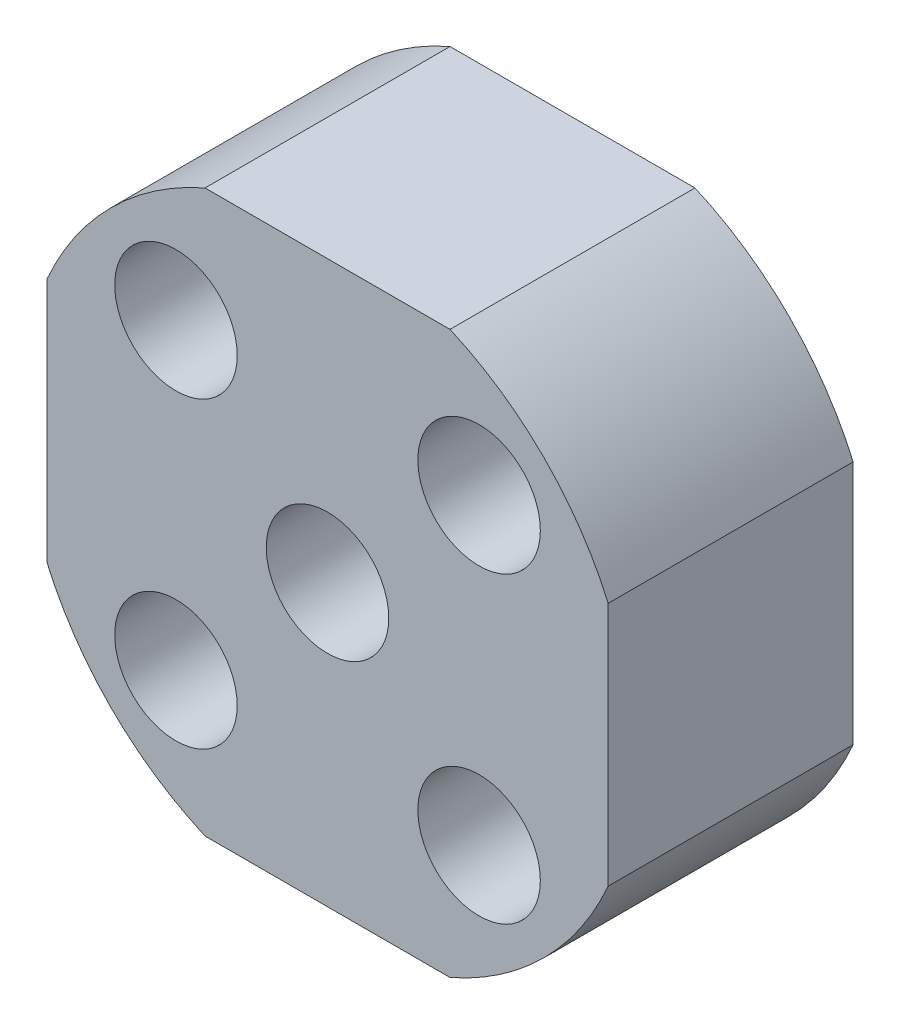
ISO-10303-21;
HEADER;
FILE_DESCRIPTION(('STEP AP214'),'2;1');
FILE_NAME('part.step','',(''),(''),'','','');
FILE_SCHEMA(('AUTOMOTIVE_DESIGN { 1 0 10303 214 1 1 1 1 }'));
ENDSEC;
DATA;
#1=APPLICATION_CONTEXT('core data for automotive mechanical design processes');
#2=APPLICATION_PROTOCOL_DEFINITION('international standard','automotive_design',2000,#1);
#3=PRODUCT_CONTEXT('',#1,'mechanical');
#4=PRODUCT('Part','Part','',(#3));
#5=PRODUCT_RELATED_PRODUCT_CATEGORY('part','',(#4));
#6=PRODUCT_DEFINITION_FORMATION('','',#4);
#7=PRODUCT_DEFINITION_CONTEXT('part definition',#1,'design');
#8=PRODUCT_DEFINITION('design','',#6,#7);
#9=PRODUCT_DEFINITION_SHAPE('','',#8);
#10=(LENGTH_UNIT() NAMED_UNIT(*) SI_UNIT(.MILLI.,.METRE.));
#11=(NAMED_UNIT(*) PLANE_ANGLE_UNIT() SI_UNIT($,.RADIAN.));
#12=(NAMED_UNIT(*) SI_UNIT($,.STERADIAN.) SOLID_ANGLE_UNIT());
#13=UNCERTAINTY_MEASURE_WITH_UNIT(LENGTH_MEASURE(1.E-05),#10,'distance_accuracy_value','');
#14=(GEOMETRIC_REPRESENTATION_CONTEXT(3) GLOBAL_UNCERTAINTY_ASSIGNED_CONTEXT((#13)) GLOBAL_UNIT_ASSIGNED_CONTEXT((#10,
#11,#12)) REPRESENTATION_CONTEXT('',''));
#15=CARTESIAN_POINT('',(0.,0.,0.));
#16=DIRECTION('',(0.,0.,1.));
#17=DIRECTION('',(1.,0.,0.));
#18=AXIS2_PLACEMENT_3D('',#15,#16,#17);
#19=CARTESIAN_POINT('',(0.,0.,2.));
#20=DIRECTION('',(0.,0.,1.));
#21=DIRECTION('',(1.,0.,0.));
#22=AXIS2_PLACEMENT_3D('',#19,#20,#21);
#23=PLANE('',#22);
#24=CARTESIAN_POINT('',(-1.23743686707646,-1.23743686707646,2.));
#25=DIRECTION('',(0.,0.,1.));
#26=DIRECTION('',(1.,0.,0.));
#27=AXIS2_PLACEMENT_3D('',#24,#25,#26);
#28=CIRCLE('',#27,0.5);
#29=CARTESIAN_POINT('',(-0.737436867076457,-1.23743686707646,2.));
#30=VERTEX_POINT('',#29);
#31=EDGE_CURVE('E195',#30,#30,#28,.T.);
#32=ORIENTED_EDGE('',*,*,#31,.F.);
#33=EDGE_LOOP('',(#32));
#34=FACE_BOUND('',#33,.T.);
#35=CARTESIAN_POINT('',(1.23743686707646,1.23743686707646,2.));
#36=DIRECTION('',(0.,0.,1.));
#37=DIRECTION('',(1.,0.,0.));
#38=AXIS2_PLACEMENT_3D('',#35,#36,#37);
#39=CIRCLE('',#38,0.5);
#40=CARTESIAN_POINT('',(1.73743686707646,1.23743686707646,2.));
#41=VERTEX_POINT('',#40);
#42=EDGE_CURVE('E183',#41,#41,#39,.T.);
#43=ORIENTED_EDGE('',*,*,#42,.F.);
#44=EDGE_LOOP('',(#43));
#45=FACE_BOUND('',#44,.T.);
#46=CARTESIAN_POINT('',(0.,0.,2.));
#47=DIRECTION('',(0.,0.,1.));
#48=DIRECTION('',(1.,0.,0.));
#49=AXIS2_PLACEMENT_3D('',#46,#47,#48);
#50=CIRCLE('',#49,2.5);
#51=CARTESIAN_POINT('',(2.29128784747792,1.,2.));
#52=VERTEX_POINT('',#51);
#53=CARTESIAN_POINT('',(1.,2.29128784747792,2.));
#54=VERTEX_POINT('',#53);
#55=EDGE_CURVE('E146',#52,#54,#50,.T.);
#56=ORIENTED_EDGE('',*,*,#55,.T.);
#57=DIRECTION('',(-1.,0.,0.));
#58=VECTOR('',#57,1.);
#59=CARTESIAN_POINT('',(1.,2.29128784747792,2.));
#60=LINE('',#59,#58);
#61=CARTESIAN_POINT('',(-1.,2.29128784747792,2.));
#62=VERTEX_POINT('',#61);
#63=EDGE_CURVE('E94',#54,#62,#60,.T.);
#64=ORIENTED_EDGE('',*,*,#63,.T.);
#65=CARTESIAN_POINT('',(0.,0.,2.));
#66=DIRECTION('',(0.,0.,1.));
#67=DIRECTION('',(1.,0.,0.));
#68=AXIS2_PLACEMENT_3D('',#65,#66,#67);
#69=CIRCLE('',#68,2.5);
#70=CARTESIAN_POINT('',(-2.29128784747792,1.,2.));
#71=VERTEX_POINT('',#70);
#72=EDGE_CURVE('E161',#62,#71,#69,.T.);
#73=ORIENTED_EDGE('',*,*,#72,.T.);
#74=DIRECTION('',(0.,-1.,0.));
#75=VECTOR('',#74,1.);
#76=CARTESIAN_POINT('',(-2.29128784747792,1.,2.));
#77=LINE('',#76,#75);
#78=CARTESIAN_POINT('',(-2.29128784747792,-1.,2.));
#79=VERTEX_POINT('',#78);
#80=EDGE_CURVE('E174',#71,#79,#77,.T.);
#81=ORIENTED_EDGE('',*,*,#80,.T.);
#82=CARTESIAN_POINT('',(0.,0.,2.));
#83=DIRECTION('',(0.,0.,1.));
#84=DIRECTION('',(1.,0.,0.));
#85=AXIS2_PLACEMENT_3D('',#82,#83,#84);
#86=CIRCLE('',#85,2.5);
#87=CARTESIAN_POINT('',(-1.,-2.29128784747792,2.));
#88=VERTEX_POINT('',#87);
#89=EDGE_CURVE('E113',#79,#88,#86,.T.);
#90=ORIENTED_EDGE('',*,*,#89,.T.);
#91=DIRECTION('',(1.,0.,0.));
#92=VECTOR('',#91,1.);
#93=CARTESIAN_POINT('',(-1.,-2.29128784747792,2.));
#94=LINE('',#93,#92);
#95=CARTESIAN_POINT('',(1.,-2.29128784747792,2.));
#96=VERTEX_POINT('',#95);
#97=EDGE_CURVE('E107',#88,#96,#94,.T.);
#98=ORIENTED_EDGE('',*,*,#97,.T.);
#99=CARTESIAN_POINT('',(0.,0.,2.));
#100=DIRECTION('',(0.,0.,1.));
#101=DIRECTION('',(1.,0.,0.));
#102=AXIS2_PLACEMENT_3D('',#99,#100,#101);
#103=CIRCLE('',#102,2.5);
#104=CARTESIAN_POINT('',(2.29128784747792,-1.,2.));
#105=VERTEX_POINT('',#104);
#106=EDGE_CURVE('E111',#96,#105,#103,.T.);
#107=ORIENTED_EDGE('',*,*,#106,.T.);
#108=DIRECTION('',(0.,1.,0.));
#109=VECTOR('',#108,1.);
#110=CARTESIAN_POINT('',(2.29128784747792,1.,2.));
#111=LINE('',#110,#109);
#112=EDGE_CURVE('E51',#105,#52,#111,.T.);
#113=ORIENTED_EDGE('',*,*,#112,.T.);
#114=EDGE_LOOP('',(#56,#64,#73,#81,#90,#98,#107,#113));
#115=FACE_BOUND('',#114,.T.);
#116=CARTESIAN_POINT('',(0.,0.,2.));
#117=DIRECTION('',(0.,0.,1.));
#118=DIRECTION('',(1.,0.,0.));
#119=AXIS2_PLACEMENT_3D('',#116,#117,#118);
#120=CIRCLE('',#119,0.5);
#121=CARTESIAN_POINT('',(0.5,0.,2.));
#122=VERTEX_POINT('',#121);
#123=EDGE_CURVE('E135',#122,#122,#120,.T.);
#124=ORIENTED_EDGE('',*,*,#123,.F.);
#125=EDGE_LOOP('',(#124));
#126=FACE_BOUND('',#125,.T.);
#127=CARTESIAN_POINT('',(1.23743686707646,-1.23743686707646,2.));
#128=DIRECTION('',(0.,0.,1.));
#129=DIRECTION('',(1.,0.,0.));
#130=AXIS2_PLACEMENT_3D('',#127,#128,#129);
#131=CIRCLE('',#130,0.5);
#132=CARTESIAN_POINT('',(1.73743686707646,-1.23743686707646,2.));
#133=VERTEX_POINT('',#132);
#134=EDGE_CURVE('E189',#133,#133,#131,.T.);
#135=ORIENTED_EDGE('',*,*,#134,.F.);
#136=EDGE_LOOP('',(#135));
#137=FACE_BOUND('',#136,.T.);
#138=CARTESIAN_POINT('',(-1.23743686707646,1.23743686707646,2.));
#139=DIRECTION('',(0.,0.,1.));
#140=DIRECTION('',(1.,0.,0.));
#141=AXIS2_PLACEMENT_3D('',#138,#139,#140);
#142=CIRCLE('',#141,0.5);
#143=CARTESIAN_POINT('',(-0.737436867076459,1.23743686707646,2.));
#144=VERTEX_POINT('',#143);
#145=EDGE_CURVE('E201',#144,#144,#142,.T.);
#146=ORIENTED_EDGE('',*,*,#145,.F.);
#147=EDGE_LOOP('',(#146));
#148=FACE_BOUND('',#147,.T.);
#149=ADVANCED_FACE('F34',(#34,#45,#115,#126,#137,#148),#23,.T.);
#150=CARTESIAN_POINT('',(0.,0.,0.));
#151=DIRECTION('',(0.,0.,1.));
#152=DIRECTION('',(1.,0.,0.));
#153=AXIS2_PLACEMENT_3D('',#150,#151,#152);
#154=PLANE('',#153);
#155=CARTESIAN_POINT('',(0.,0.,0.));
#156=DIRECTION('',(0.,0.,1.));
#157=DIRECTION('',(1.,0.,0.));
#158=AXIS2_PLACEMENT_3D('',#155,#156,#157);
#159=CIRCLE('',#158,2.5);
#160=CARTESIAN_POINT('',(2.29128784747792,1.,0.));
#161=VERTEX_POINT('',#160);
#162=CARTESIAN_POINT('',(1.,2.29128784747792,0.));
#163=VERTEX_POINT('',#162);
#164=EDGE_CURVE('E131',#161,#163,#159,.T.);
#165=ORIENTED_EDGE('',*,*,#164,.F.);
#166=DIRECTION('',(0.,1.,0.));
#167=VECTOR('',#166,1.);
#168=CARTESIAN_POINT('',(2.29128784747792,1.,0.));
#169=LINE('',#168,#167);
#170=CARTESIAN_POINT('',(2.29128784747792,-1.,0.));
#171=VERTEX_POINT('',#170);
#172=EDGE_CURVE('E86',#171,#161,#169,.T.);
#173=ORIENTED_EDGE('',*,*,#172,.F.);
#174=CARTESIAN_POINT('',(0.,0.,0.));
#175=DIRECTION('',(0.,0.,1.));
#176=DIRECTION('',(1.,0.,0.));
#177=AXIS2_PLACEMENT_3D('',#174,#175,#176);
#178=CIRCLE('',#177,2.5);
#179=CARTESIAN_POINT('',(1.,-2.29128784747792,0.));
#180=VERTEX_POINT('',#179);
#181=EDGE_CURVE('E80',#180,#171,#178,.T.);
#182=ORIENTED_EDGE('',*,*,#181,.F.);
#183=DIRECTION('',(1.,0.,0.));
#184=VECTOR('',#183,1.);
#185=CARTESIAN_POINT('',(-1.,-2.29128784747792,0.));
#186=LINE('',#185,#184);
#187=CARTESIAN_POINT('',(-1.,-2.29128784747792,0.));
#188=VERTEX_POINT('',#187);
#189=EDGE_CURVE('E121',#188,#180,#186,.T.);
#190=ORIENTED_EDGE('',*,*,#189,.F.);
#191=CARTESIAN_POINT('',(0.,0.,0.));
#192=DIRECTION('',(0.,0.,1.));
#193=DIRECTION('',(1.,0.,0.));
#194=AXIS2_PLACEMENT_3D('',#191,#192,#193);
#195=CIRCLE('',#194,2.5);
#196=CARTESIAN_POINT('',(-2.29128784747792,-1.,0.));
#197=VERTEX_POINT('',#196);
#198=EDGE_CURVE('E141',#197,#188,#195,.T.);
#199=ORIENTED_EDGE('',*,*,#198,.F.);
#200=DIRECTION('',(0.,-1.,0.));
#201=VECTOR('',#200,1.);
#202=CARTESIAN_POINT('',(-2.29128784747792,1.,0.));
#203=LINE('',#202,#201);
#204=CARTESIAN_POINT('',(-2.29128784747792,1.,0.));
#205=VERTEX_POINT('',#204);
#206=EDGE_CURVE('E139',#205,#197,#203,.T.);
#207=ORIENTED_EDGE('',*,*,#206,.F.);
#208=CARTESIAN_POINT('',(0.,0.,0.));
#209=DIRECTION('',(0.,0.,1.));
#210=DIRECTION('',(1.,0.,0.));
#211=AXIS2_PLACEMENT_3D('',#208,#209,#210);
#212=CIRCLE('',#211,2.5);
#213=CARTESIAN_POINT('',(-1.,2.29128784747792,0.));
#214=VERTEX_POINT('',#213);
#215=EDGE_CURVE('E137',#214,#205,#212,.T.);
#216=ORIENTED_EDGE('',*,*,#215,.F.);
#217=DIRECTION('',(-1.,0.,0.));
#218=VECTOR('',#217,1.);
#219=CARTESIAN_POINT('',(1.,2.29128784747792,0.));
#220=LINE('',#219,#218);
#221=EDGE_CURVE('E134',#163,#214,#220,.T.);
#222=ORIENTED_EDGE('',*,*,#221,.F.);
#223=EDGE_LOOP('',(#165,#173,#182,#190,#199,#207,#216,#222));
#224=FACE_BOUND('',#223,.T.);
#225=CARTESIAN_POINT('',(0.,0.,0.));
#226=DIRECTION('',(0.,0.,1.));
#227=DIRECTION('',(1.,0.,0.));
#228=AXIS2_PLACEMENT_3D('',#225,#226,#227);
#229=CIRCLE('',#228,0.5);
#230=CARTESIAN_POINT('',(0.5,0.,0.));
#231=VERTEX_POINT('',#230);
#232=EDGE_CURVE('E180',#231,#231,#229,.T.);
#233=ORIENTED_EDGE('',*,*,#232,.T.);
#234=EDGE_LOOP('',(#233));
#235=FACE_BOUND('',#234,.T.);
#236=CARTESIAN_POINT('',(1.23743686707646,1.23743686707646,0.));
#237=DIRECTION('',(0.,0.,1.));
#238=DIRECTION('',(1.,0.,0.));
#239=AXIS2_PLACEMENT_3D('',#236,#237,#238);
#240=CIRCLE('',#239,0.5);
#241=CARTESIAN_POINT('',(1.73743686707646,1.23743686707646,0.));
#242=VERTEX_POINT('',#241);
#243=EDGE_CURVE('E186',#242,#242,#240,.T.);
#244=ORIENTED_EDGE('',*,*,#243,.T.);
#245=EDGE_LOOP('',(#244));
#246=FACE_BOUND('',#245,.T.);
#247=CARTESIAN_POINT('',(1.23743686707646,-1.23743686707646,0.));
#248=DIRECTION('',(0.,0.,1.));
#249=DIRECTION('',(1.,0.,0.));
#250=AXIS2_PLACEMENT_3D('',#247,#248,#249);
#251=CIRCLE('',#250,0.5);
#252=CARTESIAN_POINT('',(1.73743686707646,-1.23743686707646,0.));
#253=VERTEX_POINT('',#252);
#254=EDGE_CURVE('E192',#253,#253,#251,.T.);
#255=ORIENTED_EDGE('',*,*,#254,.T.);
#256=EDGE_LOOP('',(#255));
#257=FACE_BOUND('',#256,.T.);
#258=CARTESIAN_POINT('',(-1.23743686707646,-1.23743686707646,0.));
#259=DIRECTION('',(0.,0.,1.));
#260=DIRECTION('',(1.,0.,0.));
#261=AXIS2_PLACEMENT_3D('',#258,#259,#260);
#262=CIRCLE('',#261,0.5);
#263=CARTESIAN_POINT('',(-0.737436867076457,-1.23743686707646,0.));
#264=VERTEX_POINT('',#263);
#265=EDGE_CURVE('E198',#264,#264,#262,.T.);
#266=ORIENTED_EDGE('',*,*,#265,.T.);
#267=EDGE_LOOP('',(#266));
#268=FACE_BOUND('',#267,.T.);
#269=CARTESIAN_POINT('',(-1.23743686707646,1.23743686707646,0.));
#270=DIRECTION('',(0.,0.,1.));
#271=DIRECTION('',(1.,0.,0.));
#272=AXIS2_PLACEMENT_3D('',#269,#270,#271);
#273=CIRCLE('',#272,0.5);
#274=CARTESIAN_POINT('',(-0.737436867076459,1.23743686707646,0.));
#275=VERTEX_POINT('',#274);
#276=EDGE_CURVE('E204',#275,#275,#273,.T.);
#277=ORIENTED_EDGE('',*,*,#276,.T.);
#278=EDGE_LOOP('',(#277));
#279=FACE_BOUND('',#278,.T.);
#280=ADVANCED_FACE('F165',(#224,#235,#246,#257,#268,#279),#154,.F.);
#281=CARTESIAN_POINT('',(0.,0.,2.));
#282=DIRECTION('',(0.,0.,-1.));
#283=DIRECTION('',(-1.,0.,0.));
#284=AXIS2_PLACEMENT_3D('',#281,#282,#283);
#285=CYLINDRICAL_SURFACE('',#284,2.5);
#286=ORIENTED_EDGE('',*,*,#164,.T.);
#287=DIRECTION('',(0.,0.,-1.));
#288=VECTOR('',#287,1.);
#289=CARTESIAN_POINT('',(1.,2.29128784747792,2.));
#290=LINE('',#289,#288);
#291=EDGE_CURVE('E11',#54,#163,#290,.T.);
#292=ORIENTED_EDGE('',*,*,#291,.F.);
#293=ORIENTED_EDGE('',*,*,#55,.F.);
#294=DIRECTION('',(0.,0.,-1.));
#295=VECTOR('',#294,1.);
#296=CARTESIAN_POINT('',(2.29128784747792,1.,2.));
#297=LINE('',#296,#295);
#298=EDGE_CURVE('E127',#52,#161,#297,.T.);
#299=ORIENTED_EDGE('',*,*,#298,.T.);
#300=EDGE_LOOP('',(#286,#292,#293,#299));
#301=FACE_BOUND('',#300,.T.);
#302=ADVANCED_FACE('F36',(#301),#285,.T.);
#303=CARTESIAN_POINT('',(1.,2.29128784747792,2.));
#304=DIRECTION('',(0.,-1.,0.));
#305=DIRECTION('',(0.,0.,-1.));
#306=AXIS2_PLACEMENT_3D('',#303,#304,#305);
#307=PLANE('',#306);
#308=ORIENTED_EDGE('',*,*,#221,.T.);
#309=DIRECTION('',(0.,0.,-1.));
#310=VECTOR('',#309,1.);
#311=CARTESIAN_POINT('',(-1.,2.29128784747792,2.));
#312=LINE('',#311,#310);
#313=EDGE_CURVE('E43',#62,#214,#312,.T.);
#314=ORIENTED_EDGE('',*,*,#313,.F.);
#315=ORIENTED_EDGE('',*,*,#63,.F.);
#316=ORIENTED_EDGE('',*,*,#291,.T.);
#317=EDGE_LOOP('',(#308,#314,#315,#316));
#318=FACE_BOUND('',#317,.T.);
#319=ADVANCED_FACE('F238',(#318),#307,.F.);
#320=CARTESIAN_POINT('',(0.,0.,2.));
#321=DIRECTION('',(0.,0.,-1.));
#322=DIRECTION('',(-1.,0.,0.));
#323=AXIS2_PLACEMENT_3D('',#320,#321,#322);
#324=CYLINDRICAL_SURFACE('',#323,2.5);
#325=ORIENTED_EDGE('',*,*,#215,.T.);
#326=DIRECTION('',(0.,0.,-1.));
#327=VECTOR('',#326,1.);
#328=CARTESIAN_POINT('',(-2.29128784747792,1.,2.));
#329=LINE('',#328,#327);
#330=EDGE_CURVE('E153',#71,#205,#329,.T.);
#331=ORIENTED_EDGE('',*,*,#330,.F.);
#332=ORIENTED_EDGE('',*,*,#72,.F.);
#333=ORIENTED_EDGE('',*,*,#313,.T.);
#334=EDGE_LOOP('',(#325,#331,#332,#333));
#335=FACE_BOUND('',#334,.T.);
#336=ADVANCED_FACE('F159',(#335),#324,.T.);
#337=CARTESIAN_POINT('',(-2.29128784747792,1.,2.));
#338=DIRECTION('',(1.,0.,0.));
#339=DIRECTION('',(0.,0.,-1.));
#340=AXIS2_PLACEMENT_3D('',#337,#338,#339);
#341=PLANE('',#340);
#342=ORIENTED_EDGE('',*,*,#206,.T.);
#343=DIRECTION('',(0.,0.,-1.));
#344=VECTOR('',#343,1.);
#345=CARTESIAN_POINT('',(-2.29128784747792,-1.,2.));
#346=LINE('',#345,#344);
#347=EDGE_CURVE('E150',#79,#197,#346,.T.);
#348=ORIENTED_EDGE('',*,*,#347,.F.);
#349=ORIENTED_EDGE('',*,*,#80,.F.);
#350=ORIENTED_EDGE('',*,*,#330,.T.);
#351=EDGE_LOOP('',(#342,#348,#349,#350));
#352=FACE_BOUND('',#351,.T.);
#353=ADVANCED_FACE('F170',(#352),#341,.F.);
#354=CARTESIAN_POINT('',(0.,0.,2.));
#355=DIRECTION('',(0.,0.,-1.));
#356=DIRECTION('',(-1.,0.,0.));
#357=AXIS2_PLACEMENT_3D('',#354,#355,#356);
#358=CYLINDRICAL_SURFACE('',#357,2.5);
#359=ORIENTED_EDGE('',*,*,#198,.T.);
#360=DIRECTION('',(0.,0.,-1.));
#361=VECTOR('',#360,1.);
#362=CARTESIAN_POINT('',(-1.,-2.29128784747792,2.));
#363=LINE('',#362,#361);
#364=EDGE_CURVE('E122',#88,#188,#363,.T.);
#365=ORIENTED_EDGE('',*,*,#364,.F.);
#366=ORIENTED_EDGE('',*,*,#89,.F.);
#367=ORIENTED_EDGE('',*,*,#347,.T.);
#368=EDGE_LOOP('',(#359,#365,#366,#367));
#369=FACE_BOUND('',#368,.T.);
#370=ADVANCED_FACE('F173',(#369),#358,.T.);
#371=CARTESIAN_POINT('',(-1.,-2.29128784747792,2.));
#372=DIRECTION('',(0.,1.,0.));
#373=DIRECTION('',(0.,0.,1.));
#374=AXIS2_PLACEMENT_3D('',#371,#372,#373);
#375=PLANE('',#374);
#376=ORIENTED_EDGE('',*,*,#189,.T.);
#377=DIRECTION('',(0.,0.,-1.));
#378=VECTOR('',#377,1.);
#379=CARTESIAN_POINT('',(1.,-2.29128784747792,2.));
#380=LINE('',#379,#378);
#381=EDGE_CURVE('E118',#96,#180,#380,.T.);
#382=ORIENTED_EDGE('',*,*,#381,.F.);
#383=ORIENTED_EDGE('',*,*,#97,.F.);
#384=ORIENTED_EDGE('',*,*,#364,.T.);
#385=EDGE_LOOP('',(#376,#382,#383,#384));
#386=FACE_BOUND('',#385,.T.);
#387=ADVANCED_FACE('F119',(#386),#375,.F.);
#388=CARTESIAN_POINT('',(0.,0.,2.));
#389=DIRECTION('',(0.,0.,-1.));
#390=DIRECTION('',(-1.,0.,0.));
#391=AXIS2_PLACEMENT_3D('',#388,#389,#390);
#392=CYLINDRICAL_SURFACE('',#391,2.5);
#393=ORIENTED_EDGE('',*,*,#181,.T.);
#394=DIRECTION('',(0.,0.,-1.));
#395=VECTOR('',#394,1.);
#396=CARTESIAN_POINT('',(2.29128784747792,-1.,2.));
#397=LINE('',#396,#395);
#398=EDGE_CURVE('E123',#105,#171,#397,.T.);
#399=ORIENTED_EDGE('',*,*,#398,.F.);
#400=ORIENTED_EDGE('',*,*,#106,.F.);
#401=ORIENTED_EDGE('',*,*,#381,.T.);
#402=EDGE_LOOP('',(#393,#399,#400,#401));
#403=FACE_BOUND('',#402,.T.);
#404=ADVANCED_FACE('F125',(#403),#392,.T.);
#405=CARTESIAN_POINT('',(2.29128784747792,1.,2.));
#406=DIRECTION('',(-1.,0.,0.));
#407=DIRECTION('',(0.,0.,1.));
#408=AXIS2_PLACEMENT_3D('',#405,#406,#407);
#409=PLANE('',#408);
#410=ORIENTED_EDGE('',*,*,#172,.T.);
#411=ORIENTED_EDGE('',*,*,#298,.F.);
#412=ORIENTED_EDGE('',*,*,#112,.F.);
#413=ORIENTED_EDGE('',*,*,#398,.T.);
#414=EDGE_LOOP('',(#410,#411,#412,#413));
#415=FACE_BOUND('',#414,.T.);
#416=ADVANCED_FACE('F226',(#415),#409,.F.);
#417=CARTESIAN_POINT('',(0.,0.,2.));
#418=DIRECTION('',(0.,0.,-1.));
#419=DIRECTION('',(-1.,0.,0.));
#420=AXIS2_PLACEMENT_3D('',#417,#418,#419);
#421=CYLINDRICAL_SURFACE('',#420,0.5);
#422=ORIENTED_EDGE('',*,*,#123,.T.);
#423=EDGE_LOOP('',(#422));
#424=FACE_BOUND('',#423,.T.);
#425=ORIENTED_EDGE('',*,*,#232,.F.);
#426=EDGE_LOOP('',(#425));
#427=FACE_BOUND('',#426,.T.);
#428=ADVANCED_FACE('F223',(#424,#427),#421,.F.);
#429=CARTESIAN_POINT('',(1.23743686707646,1.23743686707646,2.));
#430=DIRECTION('',(0.,0.,-1.));
#431=DIRECTION('',(-1.,0.,0.));
#432=AXIS2_PLACEMENT_3D('',#429,#430,#431);
#433=CYLINDRICAL_SURFACE('',#432,0.5);
#434=ORIENTED_EDGE('',*,*,#42,.T.);
#435=EDGE_LOOP('',(#434));
#436=FACE_BOUND('',#435,.T.);
#437=ORIENTED_EDGE('',*,*,#243,.F.);
#438=EDGE_LOOP('',(#437));
#439=FACE_BOUND('',#438,.T.);
#440=ADVANCED_FACE('F302',(#436,#439),#433,.F.);
#441=CARTESIAN_POINT('',(1.23743686707646,-1.23743686707646,2.));
#442=DIRECTION('',(0.,0.,-1.));
#443=DIRECTION('',(-1.,0.,0.));
#444=AXIS2_PLACEMENT_3D('',#441,#442,#443);
#445=CYLINDRICAL_SURFACE('',#444,0.5);
#446=ORIENTED_EDGE('',*,*,#134,.T.);
#447=EDGE_LOOP('',(#446));
#448=FACE_BOUND('',#447,.T.);
#449=ORIENTED_EDGE('',*,*,#254,.F.);
#450=EDGE_LOOP('',(#449));
#451=FACE_BOUND('',#450,.T.);
#452=ADVANCED_FACE('F310',(#448,#451),#445,.F.);
#453=CARTESIAN_POINT('',(-1.23743686707646,-1.23743686707646,2.));
#454=DIRECTION('',(0.,0.,-1.));
#455=DIRECTION('',(-1.,0.,0.));
#456=AXIS2_PLACEMENT_3D('',#453,#454,#455);
#457=CYLINDRICAL_SURFACE('',#456,0.5);
#458=ORIENTED_EDGE('',*,*,#31,.T.);
#459=EDGE_LOOP('',(#458));
#460=FACE_BOUND('',#459,.T.);
#461=ORIENTED_EDGE('',*,*,#265,.F.);
#462=EDGE_LOOP('',(#461));
#463=FACE_BOUND('',#462,.T.);
#464=ADVANCED_FACE('F318',(#460,#463),#457,.F.);
#465=CARTESIAN_POINT('',(-1.23743686707646,1.23743686707646,2.));
#466=DIRECTION('',(0.,0.,-1.));
#467=DIRECTION('',(-1.,0.,0.));
#468=AXIS2_PLACEMENT_3D('',#465,#466,#467);
#469=CYLINDRICAL_SURFACE('',#468,0.5);
#470=ORIENTED_EDGE('',*,*,#145,.T.);
#471=EDGE_LOOP('',(#470));
#472=FACE_BOUND('',#471,.T.);
#473=ORIENTED_EDGE('',*,*,#276,.F.);
#474=EDGE_LOOP('',(#473));
#475=FACE_BOUND('',#474,.T.);
#476=ADVANCED_FACE('F210',(#472,#475),#469,.F.);
#477=CLOSED_SHELL('',(#149,#280,#302,#319,#336,#353,#370,#387,#404,#416,#428,#440,#452,#464,#476));
#478=MANIFOLD_SOLID_BREP('B2',#477);
#479=ADVANCED_BREP_SHAPE_REPRESENTATION('',(#18,#478),#14);
#480=SHAPE_DEFINITION_REPRESENTATION(#9,#479);
ENDSEC;
END-ISO-10303-21;
